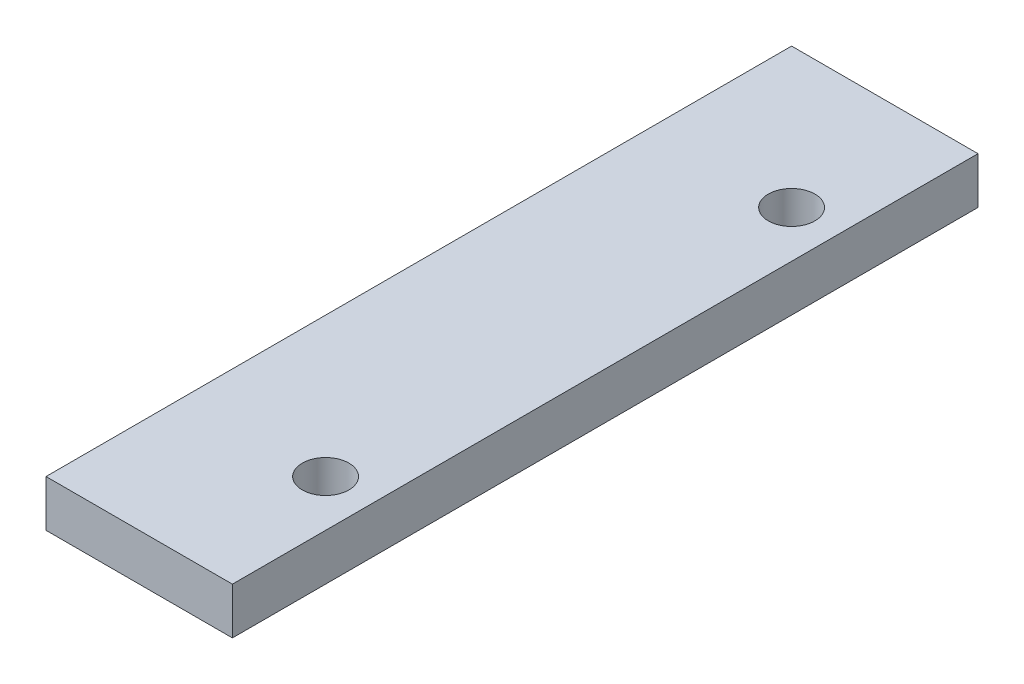
ISO-10303-21;
HEADER;
FILE_DESCRIPTION(('STEP AP214'),'2;1');
FILE_NAME('part.step','',(''),(''),'','','');
FILE_SCHEMA(('AUTOMOTIVE_DESIGN { 1 0 10303 214 1 1 1 1 }'));
ENDSEC;
DATA;
#1=APPLICATION_CONTEXT('core data for automotive mechanical design processes');
#2=APPLICATION_PROTOCOL_DEFINITION('international standard','automotive_design',2000,#1);
#3=PRODUCT_CONTEXT('',#1,'mechanical');
#4=PRODUCT('Part','Part','',(#3));
#5=PRODUCT_RELATED_PRODUCT_CATEGORY('part','',(#4));
#6=PRODUCT_DEFINITION_FORMATION('','',#4);
#7=PRODUCT_DEFINITION_CONTEXT('part definition',#1,'design');
#8=PRODUCT_DEFINITION('design','',#6,#7);
#9=PRODUCT_DEFINITION_SHAPE('','',#8);
#10=(LENGTH_UNIT() NAMED_UNIT(*) SI_UNIT(.MILLI.,.METRE.));
#11=(NAMED_UNIT(*) PLANE_ANGLE_UNIT() SI_UNIT($,.RADIAN.));
#12=(NAMED_UNIT(*) SI_UNIT($,.STERADIAN.) SOLID_ANGLE_UNIT());
#13=UNCERTAINTY_MEASURE_WITH_UNIT(LENGTH_MEASURE(1.E-05),#10,'distance_accuracy_value','');
#14=(GEOMETRIC_REPRESENTATION_CONTEXT(3) GLOBAL_UNCERTAINTY_ASSIGNED_CONTEXT((#13)) GLOBAL_UNIT_ASSIGNED_CONTEXT((#10,
#11,#12)) REPRESENTATION_CONTEXT('',''));
#15=CARTESIAN_POINT('',(0.,0.,0.));
#16=DIRECTION('',(0.,0.,1.));
#17=DIRECTION('',(1.,0.,0.));
#18=AXIS2_PLACEMENT_3D('',#15,#16,#17);
#19=CARTESIAN_POINT('',(-12.7,3.175,50.8));
#20=DIRECTION('',(1.,0.,0.));
#21=DIRECTION('',(0.,0.,-1.));
#22=AXIS2_PLACEMENT_3D('',#19,#20,#21);
#23=PLANE('',#22);
#24=DIRECTION('',(0.,0.,1.));
#25=VECTOR('',#24,1.);
#26=CARTESIAN_POINT('',(-12.7,-3.175,50.8));
#27=LINE('',#26,#25);
#28=CARTESIAN_POINT('',(-12.7,-3.175,-50.8));
#29=VERTEX_POINT('',#28);
#30=CARTESIAN_POINT('',(-12.7,-3.175,50.8));
#31=VERTEX_POINT('',#30);
#32=EDGE_CURVE('E98',#29,#31,#27,.T.);
#33=ORIENTED_EDGE('',*,*,#32,.T.);
#34=DIRECTION('',(0.,-1.,0.));
#35=VECTOR('',#34,1.);
#36=CARTESIAN_POINT('',(-12.7,3.175,50.8));
#37=LINE('',#36,#35);
#38=CARTESIAN_POINT('',(-12.7,3.175,50.8));
#39=VERTEX_POINT('',#38);
#40=EDGE_CURVE('E11',#39,#31,#37,.T.);
#41=ORIENTED_EDGE('',*,*,#40,.F.);
#42=DIRECTION('',(0.,0.,1.));
#43=VECTOR('',#42,1.);
#44=CARTESIAN_POINT('',(-12.7,3.175,50.8));
#45=LINE('',#44,#43);
#46=CARTESIAN_POINT('',(-12.7,3.175,-50.8));
#47=VERTEX_POINT('',#46);
#48=EDGE_CURVE('E86',#47,#39,#45,.T.);
#49=ORIENTED_EDGE('',*,*,#48,.F.);
#50=DIRECTION('',(0.,-1.,0.));
#51=VECTOR('',#50,1.);
#52=CARTESIAN_POINT('',(-12.7,3.175,-50.8));
#53=LINE('',#52,#51);
#54=EDGE_CURVE('E94',#47,#29,#53,.T.);
#55=ORIENTED_EDGE('',*,*,#54,.T.);
#56=EDGE_LOOP('',(#33,#41,#49,#55));
#57=FACE_BOUND('',#56,.T.);
#58=ADVANCED_FACE('F35',(#57),#23,.F.);
#59=CARTESIAN_POINT('',(12.7,3.175,50.8));
#60=DIRECTION('',(0.,0.,-1.));
#61=DIRECTION('',(-1.,0.,0.));
#62=AXIS2_PLACEMENT_3D('',#59,#60,#61);
#63=PLANE('',#62);
#64=DIRECTION('',(1.,0.,0.));
#65=VECTOR('',#64,1.);
#66=CARTESIAN_POINT('',(12.7,-3.175,50.8));
#67=LINE('',#66,#65);
#68=CARTESIAN_POINT('',(12.7,-3.175,50.8));
#69=VERTEX_POINT('',#68);
#70=EDGE_CURVE('E90',#31,#69,#67,.T.);
#71=ORIENTED_EDGE('',*,*,#70,.T.);
#72=DIRECTION('',(0.,-1.,0.));
#73=VECTOR('',#72,1.);
#74=CARTESIAN_POINT('',(12.7,3.175,50.8));
#75=LINE('',#74,#73);
#76=CARTESIAN_POINT('',(12.7,3.175,50.8));
#77=VERTEX_POINT('',#76);
#78=EDGE_CURVE('E43',#77,#69,#75,.T.);
#79=ORIENTED_EDGE('',*,*,#78,.F.);
#80=DIRECTION('',(1.,0.,0.));
#81=VECTOR('',#80,1.);
#82=CARTESIAN_POINT('',(12.7,3.175,50.8));
#83=LINE('',#82,#81);
#84=EDGE_CURVE('E81',#39,#77,#83,.T.);
#85=ORIENTED_EDGE('',*,*,#84,.F.);
#86=ORIENTED_EDGE('',*,*,#40,.T.);
#87=EDGE_LOOP('',(#71,#79,#85,#86));
#88=FACE_BOUND('',#87,.T.);
#89=ADVANCED_FACE('F89',(#88),#63,.F.);
#90=CARTESIAN_POINT('',(12.7,3.175,50.8));
#91=DIRECTION('',(-1.,0.,0.));
#92=DIRECTION('',(0.,0.,1.));
#93=AXIS2_PLACEMENT_3D('',#90,#91,#92);
#94=PLANE('',#93);
#95=DIRECTION('',(0.,0.,-1.));
#96=VECTOR('',#95,1.);
#97=CARTESIAN_POINT('',(12.7,-3.175,50.8));
#98=LINE('',#97,#96);
#99=CARTESIAN_POINT('',(12.7,-3.175,-50.8));
#100=VERTEX_POINT('',#99);
#101=EDGE_CURVE('E68',#69,#100,#98,.T.);
#102=ORIENTED_EDGE('',*,*,#101,.T.);
#103=DIRECTION('',(0.,-1.,0.));
#104=VECTOR('',#103,1.);
#105=CARTESIAN_POINT('',(12.7,3.175,-50.8));
#106=LINE('',#105,#104);
#107=CARTESIAN_POINT('',(12.7,3.175,-50.8));
#108=VERTEX_POINT('',#107);
#109=EDGE_CURVE('E91',#108,#100,#106,.T.);
#110=ORIENTED_EDGE('',*,*,#109,.F.);
#111=DIRECTION('',(0.,0.,-1.));
#112=VECTOR('',#111,1.);
#113=CARTESIAN_POINT('',(12.7,3.175,50.8));
#114=LINE('',#113,#112);
#115=EDGE_CURVE('E84',#77,#108,#114,.T.);
#116=ORIENTED_EDGE('',*,*,#115,.F.);
#117=ORIENTED_EDGE('',*,*,#78,.T.);
#118=EDGE_LOOP('',(#102,#110,#116,#117));
#119=FACE_BOUND('',#118,.T.);
#120=ADVANCED_FACE('F92',(#119),#94,.F.);
#121=CARTESIAN_POINT('',(12.7,3.175,-50.8));
#122=DIRECTION('',(0.,0.,1.));
#123=DIRECTION('',(1.,0.,0.));
#124=AXIS2_PLACEMENT_3D('',#121,#122,#123);
#125=PLANE('',#124);
#126=DIRECTION('',(-1.,0.,0.));
#127=VECTOR('',#126,1.);
#128=CARTESIAN_POINT('',(12.7,-3.175,-50.8));
#129=LINE('',#128,#127);
#130=EDGE_CURVE('E74',#100,#29,#129,.T.);
#131=ORIENTED_EDGE('',*,*,#130,.T.);
#132=ORIENTED_EDGE('',*,*,#54,.F.);
#133=DIRECTION('',(-1.,0.,0.));
#134=VECTOR('',#133,1.);
#135=CARTESIAN_POINT('',(12.7,3.175,-50.8));
#136=LINE('',#135,#134);
#137=EDGE_CURVE('E51',#108,#47,#136,.T.);
#138=ORIENTED_EDGE('',*,*,#137,.F.);
#139=ORIENTED_EDGE('',*,*,#109,.T.);
#140=EDGE_LOOP('',(#131,#132,#138,#139));
#141=FACE_BOUND('',#140,.T.);
#142=ADVANCED_FACE('F106',(#141),#125,.F.);
#143=CARTESIAN_POINT('',(0.,3.175,0.));
#144=DIRECTION('',(0.,1.,0.));
#145=DIRECTION('',(0.,0.,1.));
#146=AXIS2_PLACEMENT_3D('',#143,#144,#145);
#147=PLANE('',#146);
#148=CARTESIAN_POINT('',(6.34999999999999,3.175,31.75));
#149=DIRECTION('',(0.,1.,0.));
#150=DIRECTION('',(0.,0.,1.));
#151=AXIS2_PLACEMENT_3D('',#148,#149,#150);
#152=CIRCLE('',#151,3.17499999999999);
#153=CARTESIAN_POINT('',(6.34999999999999,3.175,34.925));
#154=VERTEX_POINT('',#153);
#155=EDGE_CURVE('E120',#154,#154,#152,.T.);
#156=ORIENTED_EDGE('',*,*,#155,.F.);
#157=EDGE_LOOP('',(#156));
#158=FACE_BOUND('',#157,.T.);
#159=CARTESIAN_POINT('',(6.34999999999999,3.175,-31.75));
#160=DIRECTION('',(0.,1.,0.));
#161=DIRECTION('',(0.,0.,1.));
#162=AXIS2_PLACEMENT_3D('',#159,#160,#161);
#163=CIRCLE('',#162,3.17499999999999);
#164=CARTESIAN_POINT('',(6.34999999999999,3.175,-28.575));
#165=VERTEX_POINT('',#164);
#166=EDGE_CURVE('E114',#165,#165,#163,.T.);
#167=ORIENTED_EDGE('',*,*,#166,.F.);
#168=EDGE_LOOP('',(#167));
#169=FACE_BOUND('',#168,.T.);
#170=ORIENTED_EDGE('',*,*,#48,.T.);
#171=ORIENTED_EDGE('',*,*,#84,.T.);
#172=ORIENTED_EDGE('',*,*,#115,.T.);
#173=ORIENTED_EDGE('',*,*,#137,.T.);
#174=EDGE_LOOP('',(#170,#171,#172,#173));
#175=FACE_BOUND('',#174,.T.);
#176=ADVANCED_FACE('F82',(#158,#169,#175),#147,.T.);
#177=CARTESIAN_POINT('',(0.,-3.175,0.));
#178=DIRECTION('',(0.,1.,0.));
#179=DIRECTION('',(0.,0.,1.));
#180=AXIS2_PLACEMENT_3D('',#177,#178,#179);
#181=PLANE('',#180);
#182=CARTESIAN_POINT('',(6.34999999999999,-3.175,31.75));
#183=DIRECTION('',(0.,1.,0.));
#184=DIRECTION('',(0.,0.,1.));
#185=AXIS2_PLACEMENT_3D('',#182,#183,#184);
#186=CIRCLE('',#185,3.175);
#187=CARTESIAN_POINT('',(6.34999999999999,-3.175,34.925));
#188=VERTEX_POINT('',#187);
#189=EDGE_CURVE('E117',#188,#188,#186,.T.);
#190=ORIENTED_EDGE('',*,*,#189,.T.);
#191=EDGE_LOOP('',(#190));
#192=FACE_BOUND('',#191,.T.);
#193=CARTESIAN_POINT('',(6.34999999999999,-3.175,-31.75));
#194=DIRECTION('',(0.,1.,0.));
#195=DIRECTION('',(0.,0.,1.));
#196=AXIS2_PLACEMENT_3D('',#193,#194,#195);
#197=CIRCLE('',#196,3.175);
#198=CARTESIAN_POINT('',(6.34999999999999,-3.175,-28.575));
#199=VERTEX_POINT('',#198);
#200=EDGE_CURVE('E101',#199,#199,#197,.T.);
#201=ORIENTED_EDGE('',*,*,#200,.T.);
#202=EDGE_LOOP('',(#201));
#203=FACE_BOUND('',#202,.T.);
#204=ORIENTED_EDGE('',*,*,#32,.F.);
#205=ORIENTED_EDGE('',*,*,#130,.F.);
#206=ORIENTED_EDGE('',*,*,#101,.F.);
#207=ORIENTED_EDGE('',*,*,#70,.F.);
#208=EDGE_LOOP('',(#204,#205,#206,#207));
#209=FACE_BOUND('',#208,.T.);
#210=ADVANCED_FACE('F109',(#192,#203,#209),#181,.F.);
#211=CARTESIAN_POINT('',(6.34999999999999,3.175,-31.75));
#212=DIRECTION('',(0.,1.,0.));
#213=DIRECTION('',(0.,0.,1.));
#214=AXIS2_PLACEMENT_3D('',#211,#212,#213);
#215=CYLINDRICAL_SURFACE('',#214,3.17499999999999);
#216=ORIENTED_EDGE('',*,*,#200,.F.);
#217=EDGE_LOOP('',(#216));
#218=FACE_BOUND('',#217,.T.);
#219=ORIENTED_EDGE('',*,*,#166,.T.);
#220=EDGE_LOOP('',(#219));
#221=FACE_BOUND('',#220,.T.);
#222=ADVANCED_FACE('F131',(#218,#221),#215,.F.);
#223=CARTESIAN_POINT('',(6.34999999999999,3.175,31.75));
#224=DIRECTION('',(0.,1.,0.));
#225=DIRECTION('',(0.,0.,1.));
#226=AXIS2_PLACEMENT_3D('',#223,#224,#225);
#227=CYLINDRICAL_SURFACE('',#226,3.17499999999999);
#228=ORIENTED_EDGE('',*,*,#189,.F.);
#229=EDGE_LOOP('',(#228));
#230=FACE_BOUND('',#229,.T.);
#231=ORIENTED_EDGE('',*,*,#155,.T.);
#232=EDGE_LOOP('',(#231));
#233=FACE_BOUND('',#232,.T.);
#234=ADVANCED_FACE('F124',(#230,#233),#227,.F.);
#235=CLOSED_SHELL('',(#58,#89,#120,#142,#176,#210,#222,#234));
#236=MANIFOLD_SOLID_BREP('B2',#235);
#237=ADVANCED_BREP_SHAPE_REPRESENTATION('',(#18,#236),#14);
#238=SHAPE_DEFINITION_REPRESENTATION(#9,#237);
ENDSEC;
END-ISO-10303-21;
